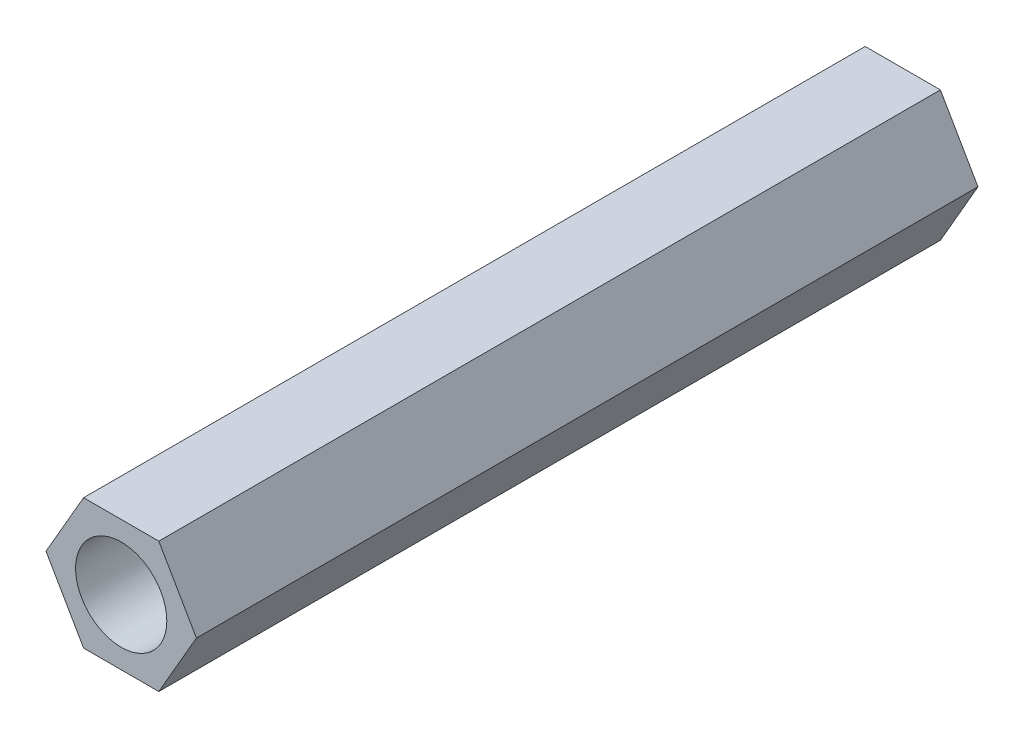
ISO-10303-21;
HEADER;
FILE_DESCRIPTION(('STEP AP214'),'2;1');
FILE_NAME('part.step','',(''),(''),'','','');
FILE_SCHEMA(('AUTOMOTIVE_DESIGN { 1 0 10303 214 1 1 1 1 }'));
ENDSEC;
DATA;
#1=APPLICATION_CONTEXT('core data for automotive mechanical design processes');
#2=APPLICATION_PROTOCOL_DEFINITION('international standard','automotive_design',2000,#1);
#3=PRODUCT_CONTEXT('',#1,'mechanical');
#4=PRODUCT('Part','Part','',(#3));
#5=PRODUCT_RELATED_PRODUCT_CATEGORY('part','',(#4));
#6=PRODUCT_DEFINITION_FORMATION('','',#4);
#7=PRODUCT_DEFINITION_CONTEXT('part definition',#1,'design');
#8=PRODUCT_DEFINITION('design','',#6,#7);
#9=PRODUCT_DEFINITION_SHAPE('','',#8);
#10=(LENGTH_UNIT() NAMED_UNIT(*) SI_UNIT(.MILLI.,.METRE.));
#11=(NAMED_UNIT(*) PLANE_ANGLE_UNIT() SI_UNIT($,.RADIAN.));
#12=(NAMED_UNIT(*) SI_UNIT($,.STERADIAN.) SOLID_ANGLE_UNIT());
#13=UNCERTAINTY_MEASURE_WITH_UNIT(LENGTH_MEASURE(1.E-05),#10,'distance_accuracy_value','');
#14=(GEOMETRIC_REPRESENTATION_CONTEXT(3) GLOBAL_UNCERTAINTY_ASSIGNED_CONTEXT((#13)) GLOBAL_UNIT_ASSIGNED_CONTEXT((#10,
#11,#12)) REPRESENTATION_CONTEXT('',''));
#15=CARTESIAN_POINT('',(0.,0.,0.));
#16=DIRECTION('',(0.,0.,1.));
#17=DIRECTION('',(1.,0.,0.));
#18=AXIS2_PLACEMENT_3D('',#15,#16,#17);
#19=CARTESIAN_POINT('',(1.44337567297409,-2.49999999999999,30.));
#20=DIRECTION('',(-0.866025403784442,0.499999999999995,0.));
#21=DIRECTION('',(-0.499999999999995,-0.866025403784442,0.));
#22=AXIS2_PLACEMENT_3D('',#19,#20,#21);
#23=PLANE('',#22);
#24=DIRECTION('',(0.499999999999995,0.866025403784442,0.));
#25=VECTOR('',#24,1.);
#26=CARTESIAN_POINT('',(1.44337567297409,-2.49999999999999,0.));
#27=LINE('',#26,#25);
#28=CARTESIAN_POINT('',(1.44337567297409,-2.49999999999999,0.));
#29=VERTEX_POINT('',#28);
#30=CARTESIAN_POINT('',(2.88675134594813,0.,0.));
#31=VERTEX_POINT('',#30);
#32=EDGE_CURVE('E117',#29,#31,#27,.T.);
#33=ORIENTED_EDGE('',*,*,#32,.T.);
#34=DIRECTION('',(0.,0.,-1.));
#35=VECTOR('',#34,1.);
#36=CARTESIAN_POINT('',(2.88675134594813,0.,30.));
#37=LINE('',#36,#35);
#38=CARTESIAN_POINT('',(2.88675134594813,0.,30.));
#39=VERTEX_POINT('',#38);
#40=EDGE_CURVE('E11',#39,#31,#37,.T.);
#41=ORIENTED_EDGE('',*,*,#40,.F.);
#42=DIRECTION('',(0.499999999999995,0.866025403784442,0.));
#43=VECTOR('',#42,1.);
#44=CARTESIAN_POINT('',(1.44337567297409,-2.49999999999999,30.));
#45=LINE('',#44,#43);
#46=CARTESIAN_POINT('',(1.44337567297409,-2.49999999999999,30.));
#47=VERTEX_POINT('',#46);
#48=EDGE_CURVE('E128',#47,#39,#45,.T.);
#49=ORIENTED_EDGE('',*,*,#48,.F.);
#50=DIRECTION('',(0.,0.,-1.));
#51=VECTOR('',#50,1.);
#52=CARTESIAN_POINT('',(1.44337567297409,-2.49999999999999,30.));
#53=LINE('',#52,#51);
#54=EDGE_CURVE('E113',#47,#29,#53,.T.);
#55=ORIENTED_EDGE('',*,*,#54,.T.);
#56=EDGE_LOOP('',(#33,#41,#49,#55));
#57=FACE_BOUND('',#56,.T.);
#58=ADVANCED_FACE('F33',(#57),#23,.F.);
#59=CARTESIAN_POINT('',(2.88675134594813,0.,30.));
#60=DIRECTION('',(-0.866025403784438,-0.500000000000001,0.));
#61=DIRECTION('',(0.500000000000001,-0.866025403784438,0.));
#62=AXIS2_PLACEMENT_3D('',#59,#60,#61);
#63=PLANE('',#62);
#64=DIRECTION('',(-0.500000000000001,0.866025403784438,0.));
#65=VECTOR('',#64,1.);
#66=CARTESIAN_POINT('',(2.88675134594813,0.,0.));
#67=LINE('',#66,#65);
#68=CARTESIAN_POINT('',(1.44337567297406,2.50000000000001,0.));
#69=VERTEX_POINT('',#68);
#70=EDGE_CURVE('E120',#31,#69,#67,.T.);
#71=ORIENTED_EDGE('',*,*,#70,.T.);
#72=DIRECTION('',(0.,0.,-1.));
#73=VECTOR('',#72,1.);
#74=CARTESIAN_POINT('',(1.44337567297406,2.50000000000001,30.));
#75=LINE('',#74,#73);
#76=CARTESIAN_POINT('',(1.44337567297406,2.50000000000001,30.));
#77=VERTEX_POINT('',#76);
#78=EDGE_CURVE('E41',#77,#69,#75,.T.);
#79=ORIENTED_EDGE('',*,*,#78,.F.);
#80=DIRECTION('',(-0.500000000000001,0.866025403784438,0.));
#81=VECTOR('',#80,1.);
#82=CARTESIAN_POINT('',(2.88675134594813,0.,30.));
#83=LINE('',#82,#81);
#84=EDGE_CURVE('E86',#39,#77,#83,.T.);
#85=ORIENTED_EDGE('',*,*,#84,.F.);
#86=ORIENTED_EDGE('',*,*,#40,.T.);
#87=EDGE_LOOP('',(#71,#79,#85,#86));
#88=FACE_BOUND('',#87,.T.);
#89=ADVANCED_FACE('F153',(#88),#63,.F.);
#90=CARTESIAN_POINT('',(1.44337567297406,2.50000000000001,30.));
#91=DIRECTION('',(0.,-1.,0.));
#92=DIRECTION('',(1.,0.,0.));
#93=AXIS2_PLACEMENT_3D('',#90,#91,#92);
#94=PLANE('',#93);
#95=DIRECTION('',(-1.,0.,0.));
#96=VECTOR('',#95,1.);
#97=CARTESIAN_POINT('',(1.44337567297406,2.50000000000001,0.));
#98=LINE('',#97,#96);
#99=CARTESIAN_POINT('',(-1.44337567297408,2.5,0.));
#100=VERTEX_POINT('',#99);
#101=EDGE_CURVE('E123',#69,#100,#98,.T.);
#102=ORIENTED_EDGE('',*,*,#101,.T.);
#103=DIRECTION('',(0.,0.,-1.));
#104=VECTOR('',#103,1.);
#105=CARTESIAN_POINT('',(-1.44337567297408,2.5,30.));
#106=LINE('',#105,#104);
#107=CARTESIAN_POINT('',(-1.44337567297408,2.5,30.));
#108=VERTEX_POINT('',#107);
#109=EDGE_CURVE('E108',#108,#100,#106,.T.);
#110=ORIENTED_EDGE('',*,*,#109,.F.);
#111=DIRECTION('',(-1.,0.,0.));
#112=VECTOR('',#111,1.);
#113=CARTESIAN_POINT('',(1.44337567297406,2.50000000000001,30.));
#114=LINE('',#113,#112);
#115=EDGE_CURVE('E99',#77,#108,#114,.T.);
#116=ORIENTED_EDGE('',*,*,#115,.F.);
#117=ORIENTED_EDGE('',*,*,#78,.T.);
#118=EDGE_LOOP('',(#102,#110,#116,#117));
#119=FACE_BOUND('',#118,.T.);
#120=ADVANCED_FACE('F134',(#119),#94,.F.);
#121=CARTESIAN_POINT('',(-1.44337567297408,2.5,30.));
#122=DIRECTION('',(0.866025403784442,-0.499999999999995,0.));
#123=DIRECTION('',(0.499999999999995,0.866025403784442,0.));
#124=AXIS2_PLACEMENT_3D('',#121,#122,#123);
#125=PLANE('',#124);
#126=DIRECTION('',(-0.499999999999995,-0.866025403784442,0.));
#127=VECTOR('',#126,1.);
#128=CARTESIAN_POINT('',(-1.44337567297408,2.5,0.));
#129=LINE('',#128,#127);
#130=CARTESIAN_POINT('',(-2.88675134594813,0.,0.));
#131=VERTEX_POINT('',#130);
#132=EDGE_CURVE('E107',#100,#131,#129,.T.);
#133=ORIENTED_EDGE('',*,*,#132,.T.);
#134=DIRECTION('',(0.,0.,-1.));
#135=VECTOR('',#134,1.);
#136=CARTESIAN_POINT('',(-2.88675134594813,0.,30.));
#137=LINE('',#136,#135);
#138=CARTESIAN_POINT('',(-2.88675134594813,0.,30.));
#139=VERTEX_POINT('',#138);
#140=EDGE_CURVE('E104',#139,#131,#137,.T.);
#141=ORIENTED_EDGE('',*,*,#140,.F.);
#142=DIRECTION('',(-0.499999999999995,-0.866025403784442,0.));
#143=VECTOR('',#142,1.);
#144=CARTESIAN_POINT('',(-1.44337567297408,2.5,30.));
#145=LINE('',#144,#143);
#146=EDGE_CURVE('E93',#108,#139,#145,.T.);
#147=ORIENTED_EDGE('',*,*,#146,.F.);
#148=ORIENTED_EDGE('',*,*,#109,.T.);
#149=EDGE_LOOP('',(#133,#141,#147,#148));
#150=FACE_BOUND('',#149,.T.);
#151=ADVANCED_FACE('F105',(#150),#125,.F.);
#152=CARTESIAN_POINT('',(-2.88675134594813,0.,30.));
#153=DIRECTION('',(0.866025403784435,0.500000000000007,0.));
#154=DIRECTION('',(-0.500000000000007,0.866025403784435,0.));
#155=AXIS2_PLACEMENT_3D('',#152,#153,#154);
#156=PLANE('',#155);
#157=DIRECTION('',(0.500000000000007,-0.866025403784435,0.));
#158=VECTOR('',#157,1.);
#159=CARTESIAN_POINT('',(-2.88675134594813,0.,0.));
#160=LINE('',#159,#158);
#161=CARTESIAN_POINT('',(-1.44337567297404,-2.50000000000002,0.));
#162=VERTEX_POINT('',#161);
#163=EDGE_CURVE('E72',#131,#162,#160,.T.);
#164=ORIENTED_EDGE('',*,*,#163,.T.);
#165=DIRECTION('',(0.,0.,-1.));
#166=VECTOR('',#165,1.);
#167=CARTESIAN_POINT('',(-1.44337567297404,-2.50000000000002,30.));
#168=LINE('',#167,#166);
#169=CARTESIAN_POINT('',(-1.44337567297404,-2.50000000000002,30.));
#170=VERTEX_POINT('',#169);
#171=EDGE_CURVE('E109',#170,#162,#168,.T.);
#172=ORIENTED_EDGE('',*,*,#171,.F.);
#173=DIRECTION('',(0.500000000000007,-0.866025403784435,0.));
#174=VECTOR('',#173,1.);
#175=CARTESIAN_POINT('',(-2.88675134594813,0.,30.));
#176=LINE('',#175,#174);
#177=EDGE_CURVE('E97',#139,#170,#176,.T.);
#178=ORIENTED_EDGE('',*,*,#177,.F.);
#179=ORIENTED_EDGE('',*,*,#140,.T.);
#180=EDGE_LOOP('',(#164,#172,#178,#179));
#181=FACE_BOUND('',#180,.T.);
#182=ADVANCED_FACE('F111',(#181),#156,.F.);
#183=CARTESIAN_POINT('',(-1.44337567297404,-2.50000000000002,30.));
#184=DIRECTION('',(0.,1.,0.));
#185=DIRECTION('',(-1.,0.,0.));
#186=AXIS2_PLACEMENT_3D('',#183,#184,#185);
#187=PLANE('',#186);
#188=DIRECTION('',(1.,0.,0.));
#189=VECTOR('',#188,1.);
#190=CARTESIAN_POINT('',(-1.44337567297404,-2.50000000000002,0.));
#191=LINE('',#190,#189);
#192=EDGE_CURVE('E78',#162,#29,#191,.T.);
#193=ORIENTED_EDGE('',*,*,#192,.T.);
#194=ORIENTED_EDGE('',*,*,#54,.F.);
#195=DIRECTION('',(1.,0.,0.));
#196=VECTOR('',#195,1.);
#197=CARTESIAN_POINT('',(-1.44337567297404,-2.50000000000002,30.));
#198=LINE('',#197,#196);
#199=EDGE_CURVE('E49',#170,#47,#198,.T.);
#200=ORIENTED_EDGE('',*,*,#199,.F.);
#201=ORIENTED_EDGE('',*,*,#171,.T.);
#202=EDGE_LOOP('',(#193,#194,#200,#201));
#203=FACE_BOUND('',#202,.T.);
#204=ADVANCED_FACE('F141',(#203),#187,.F.);
#205=CARTESIAN_POINT('',(0.,0.,30.));
#206=DIRECTION('',(0.,0.,1.));
#207=DIRECTION('',(1.,0.,0.));
#208=AXIS2_PLACEMENT_3D('',#205,#206,#207);
#209=PLANE('',#208);
#210=CARTESIAN_POINT('',(0.,0.,30.));
#211=DIRECTION('',(0.,0.,1.));
#212=DIRECTION('',(1.,0.,0.));
#213=AXIS2_PLACEMENT_3D('',#210,#211,#212);
#214=CIRCLE('',#213,1.75);
#215=CARTESIAN_POINT('',(1.75,0.,30.));
#216=VERTEX_POINT('',#215);
#217=EDGE_CURVE('E208',#216,#216,#214,.T.);
#218=ORIENTED_EDGE('',*,*,#217,.F.);
#219=EDGE_LOOP('',(#218));
#220=FACE_BOUND('',#219,.T.);
#221=ORIENTED_EDGE('',*,*,#48,.T.);
#222=ORIENTED_EDGE('',*,*,#84,.T.);
#223=ORIENTED_EDGE('',*,*,#115,.T.);
#224=ORIENTED_EDGE('',*,*,#146,.T.);
#225=ORIENTED_EDGE('',*,*,#177,.T.);
#226=ORIENTED_EDGE('',*,*,#199,.T.);
#227=EDGE_LOOP('',(#221,#222,#223,#224,#225,#226));
#228=FACE_BOUND('',#227,.T.);
#229=ADVANCED_FACE('F95',(#220,#228),#209,.T.);
#230=CARTESIAN_POINT('',(0.,0.,0.));
#231=DIRECTION('',(0.,0.,1.));
#232=DIRECTION('',(1.,0.,0.));
#233=AXIS2_PLACEMENT_3D('',#230,#231,#232);
#234=PLANE('',#233);
#235=CARTESIAN_POINT('',(0.,0.,0.));
#236=DIRECTION('',(0.,0.,1.));
#237=DIRECTION('',(1.,0.,0.));
#238=AXIS2_PLACEMENT_3D('',#235,#236,#237);
#239=CIRCLE('',#238,1.75);
#240=CARTESIAN_POINT('',(1.75,0.,0.));
#241=VERTEX_POINT('',#240);
#242=EDGE_CURVE('E121',#241,#241,#239,.T.);
#243=ORIENTED_EDGE('',*,*,#242,.T.);
#244=EDGE_LOOP('',(#243));
#245=FACE_BOUND('',#244,.T.);
#246=ORIENTED_EDGE('',*,*,#32,.F.);
#247=ORIENTED_EDGE('',*,*,#192,.F.);
#248=ORIENTED_EDGE('',*,*,#163,.F.);
#249=ORIENTED_EDGE('',*,*,#132,.F.);
#250=ORIENTED_EDGE('',*,*,#101,.F.);
#251=ORIENTED_EDGE('',*,*,#70,.F.);
#252=EDGE_LOOP('',(#246,#247,#248,#249,#250,#251));
#253=FACE_BOUND('',#252,.T.);
#254=ADVANCED_FACE('F137',(#245,#253),#234,.F.);
#255=CARTESIAN_POINT('',(0.,0.,0.));
#256=DIRECTION('',(0.,0.,1.));
#257=DIRECTION('',(1.,0.,0.));
#258=AXIS2_PLACEMENT_3D('',#255,#256,#257);
#259=CYLINDRICAL_SURFACE('',#258,1.75);
#260=ORIENTED_EDGE('',*,*,#242,.F.);
#261=EDGE_LOOP('',(#260));
#262=FACE_BOUND('',#261,.T.);
#263=ORIENTED_EDGE('',*,*,#217,.T.);
#264=EDGE_LOOP('',(#263));
#265=FACE_BOUND('',#264,.T.);
#266=ADVANCED_FACE('F190',(#262,#265),#259,.F.);
#267=CLOSED_SHELL('',(#58,#89,#120,#151,#182,#204,#229,#254,#266));
#268=MANIFOLD_SOLID_BREP('B2',#267);
#269=ADVANCED_BREP_SHAPE_REPRESENTATION('',(#18,#268),#14);
#270=SHAPE_DEFINITION_REPRESENTATION(#9,#269);
ENDSEC;
END-ISO-10303-21;
